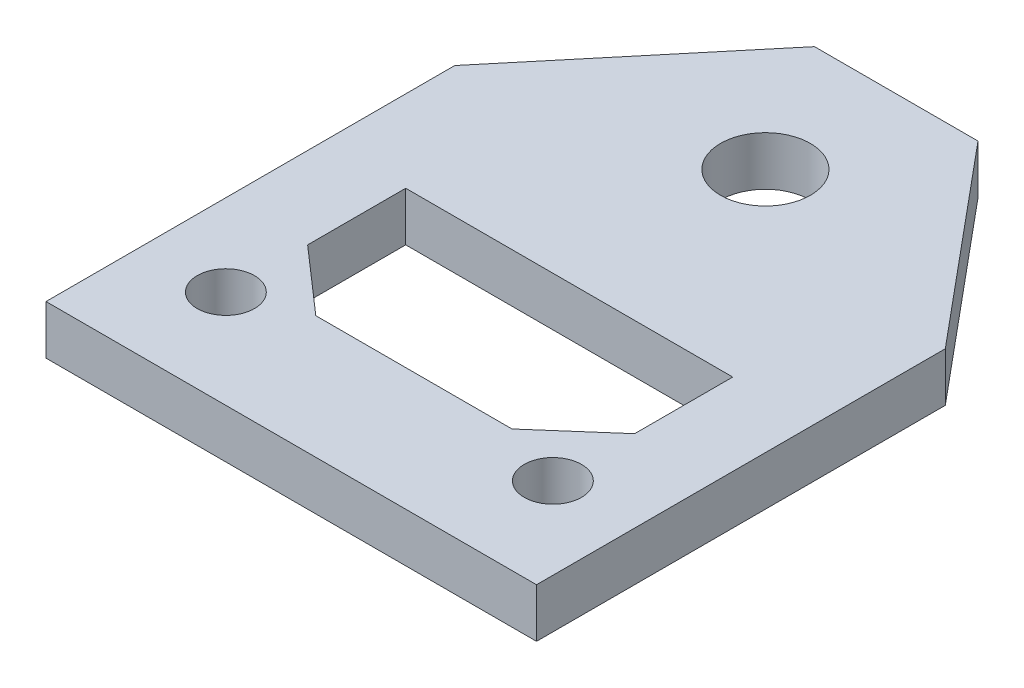
ISO-10303-21;
HEADER;
FILE_DESCRIPTION(('STEP AP214'),'2;1');
FILE_NAME('part.step','',(''),(''),'','','');
FILE_SCHEMA(('AUTOMOTIVE_DESIGN { 1 0 10303 214 1 1 1 1 }'));
ENDSEC;
DATA;
#1=APPLICATION_CONTEXT('core data for automotive mechanical design processes');
#2=APPLICATION_PROTOCOL_DEFINITION('international standard','automotive_design',2000,#1);
#3=PRODUCT_CONTEXT('',#1,'mechanical');
#4=PRODUCT('Part','Part','',(#3));
#5=PRODUCT_RELATED_PRODUCT_CATEGORY('part','',(#4));
#6=PRODUCT_DEFINITION_FORMATION('','',#4);
#7=PRODUCT_DEFINITION_CONTEXT('part definition',#1,'design');
#8=PRODUCT_DEFINITION('design','',#6,#7);
#9=PRODUCT_DEFINITION_SHAPE('','',#8);
#10=(LENGTH_UNIT() NAMED_UNIT(*) SI_UNIT(.MILLI.,.METRE.));
#11=(NAMED_UNIT(*) PLANE_ANGLE_UNIT() SI_UNIT($,.RADIAN.));
#12=(NAMED_UNIT(*) SI_UNIT($,.STERADIAN.) SOLID_ANGLE_UNIT());
#13=UNCERTAINTY_MEASURE_WITH_UNIT(LENGTH_MEASURE(1.E-05),#10,'distance_accuracy_value','');
#14=(GEOMETRIC_REPRESENTATION_CONTEXT(3) GLOBAL_UNCERTAINTY_ASSIGNED_CONTEXT((#13)) GLOBAL_UNIT_ASSIGNED_CONTEXT((#10,
#11,#12)) REPRESENTATION_CONTEXT('',''));
#15=CARTESIAN_POINT('',(0.,0.,0.));
#16=DIRECTION('',(0.,0.,1.));
#17=DIRECTION('',(1.,0.,0.));
#18=AXIS2_PLACEMENT_3D('',#15,#16,#17);
#19=CARTESIAN_POINT('',(15.,-3.,-25.));
#20=DIRECTION('',(1.,0.,0.));
#21=DIRECTION('',(0.,0.,-1.));
#22=AXIS2_PLACEMENT_3D('',#19,#20,#21);
#23=PLANE('',#22);
#24=DIRECTION('',(0.,0.,-1.));
#25=VECTOR('',#24,1.);
#26=CARTESIAN_POINT('',(15.,0.,-25.));
#27=LINE('',#26,#25);
#28=CARTESIAN_POINT('',(15.,0.,0.));
#29=VERTEX_POINT('',#28);
#30=CARTESIAN_POINT('',(15.,0.,-25.));
#31=VERTEX_POINT('',#30);
#32=EDGE_CURVE('E175',#29,#31,#27,.T.);
#33=ORIENTED_EDGE('',*,*,#32,.F.);
#34=DIRECTION('',(0.,1.,0.));
#35=VECTOR('',#34,1.);
#36=CARTESIAN_POINT('',(15.,-3.,0.));
#37=LINE('',#36,#35);
#38=CARTESIAN_POINT('',(15.,-3.,0.));
#39=VERTEX_POINT('',#38);
#40=EDGE_CURVE('E11',#39,#29,#37,.T.);
#41=ORIENTED_EDGE('',*,*,#40,.F.);
#42=DIRECTION('',(0.,0.,-1.));
#43=VECTOR('',#42,1.);
#44=CARTESIAN_POINT('',(15.,-3.,-25.));
#45=LINE('',#44,#43);
#46=CARTESIAN_POINT('',(15.,-3.,-25.));
#47=VERTEX_POINT('',#46);
#48=EDGE_CURVE('E183',#39,#47,#45,.T.);
#49=ORIENTED_EDGE('',*,*,#48,.T.);
#50=DIRECTION('',(0.,1.,0.));
#51=VECTOR('',#50,1.);
#52=CARTESIAN_POINT('',(15.,-3.,-25.));
#53=LINE('',#52,#51);
#54=EDGE_CURVE('E40',#47,#31,#53,.T.);
#55=ORIENTED_EDGE('',*,*,#54,.T.);
#56=EDGE_LOOP('',(#33,#41,#49,#55));
#57=FACE_BOUND('',#56,.T.);
#58=ADVANCED_FACE('F37',(#57),#23,.T.);
#59=CARTESIAN_POINT('',(-15.,-3.,0.));
#60=DIRECTION('',(0.,0.,1.));
#61=DIRECTION('',(1.,0.,0.));
#62=AXIS2_PLACEMENT_3D('',#59,#60,#61);
#63=PLANE('',#62);
#64=DIRECTION('',(1.,0.,0.));
#65=VECTOR('',#64,1.);
#66=CARTESIAN_POINT('',(-15.,0.,0.));
#67=LINE('',#66,#65);
#68=CARTESIAN_POINT('',(-15.,0.,0.));
#69=VERTEX_POINT('',#68);
#70=EDGE_CURVE('E187',#69,#29,#67,.T.);
#71=ORIENTED_EDGE('',*,*,#70,.F.);
#72=DIRECTION('',(0.,1.,0.));
#73=VECTOR('',#72,1.);
#74=CARTESIAN_POINT('',(-15.,-3.,0.));
#75=LINE('',#74,#73);
#76=CARTESIAN_POINT('',(-15.,-3.,0.));
#77=VERTEX_POINT('',#76);
#78=EDGE_CURVE('E45',#77,#69,#75,.T.);
#79=ORIENTED_EDGE('',*,*,#78,.F.);
#80=DIRECTION('',(1.,0.,0.));
#81=VECTOR('',#80,1.);
#82=CARTESIAN_POINT('',(-15.,-3.,0.));
#83=LINE('',#82,#81);
#84=EDGE_CURVE('E199',#77,#39,#83,.T.);
#85=ORIENTED_EDGE('',*,*,#84,.T.);
#86=ORIENTED_EDGE('',*,*,#40,.T.);
#87=EDGE_LOOP('',(#71,#79,#85,#86));
#88=FACE_BOUND('',#87,.T.);
#89=ADVANCED_FACE('F236',(#88),#63,.T.);
#90=CARTESIAN_POINT('',(-15.,-3.,-25.));
#91=DIRECTION('',(-1.,0.,0.));
#92=DIRECTION('',(0.,0.,1.));
#93=AXIS2_PLACEMENT_3D('',#90,#91,#92);
#94=PLANE('',#93);
#95=DIRECTION('',(0.,0.,1.));
#96=VECTOR('',#95,1.);
#97=CARTESIAN_POINT('',(-15.,0.,-25.));
#98=LINE('',#97,#96);
#99=CARTESIAN_POINT('',(-15.,0.,-25.));
#100=VERTEX_POINT('',#99);
#101=EDGE_CURVE('E213',#100,#69,#98,.T.);
#102=ORIENTED_EDGE('',*,*,#101,.F.);
#103=DIRECTION('',(0.,1.,0.));
#104=VECTOR('',#103,1.);
#105=CARTESIAN_POINT('',(-15.,-3.,-25.));
#106=LINE('',#105,#104);
#107=CARTESIAN_POINT('',(-15.,-3.,-25.));
#108=VERTEX_POINT('',#107);
#109=EDGE_CURVE('E219',#108,#100,#106,.T.);
#110=ORIENTED_EDGE('',*,*,#109,.F.);
#111=DIRECTION('',(0.,0.,1.));
#112=VECTOR('',#111,1.);
#113=CARTESIAN_POINT('',(-15.,-3.,-25.));
#114=LINE('',#113,#112);
#115=EDGE_CURVE('E196',#108,#77,#114,.T.);
#116=ORIENTED_EDGE('',*,*,#115,.T.);
#117=ORIENTED_EDGE('',*,*,#78,.T.);
#118=EDGE_LOOP('',(#102,#110,#116,#117));
#119=FACE_BOUND('',#118,.T.);
#120=ADVANCED_FACE('F247',(#119),#94,.T.);
#121=CARTESIAN_POINT('',(-5.,-3.,-37.));
#122=DIRECTION('',(-0.768221279597376,0.,-0.64018439966448));
#123=DIRECTION('',(-0.64018439966448,0.,0.768221279597376));
#124=AXIS2_PLACEMENT_3D('',#121,#122,#123);
#125=PLANE('',#124);
#126=DIRECTION('',(-0.64018439966448,0.,0.768221279597376));
#127=VECTOR('',#126,1.);
#128=CARTESIAN_POINT('',(-5.,0.,-37.));
#129=LINE('',#128,#127);
#130=CARTESIAN_POINT('',(-5.,0.,-37.));
#131=VERTEX_POINT('',#130);
#132=EDGE_CURVE('E210',#131,#100,#129,.T.);
#133=ORIENTED_EDGE('',*,*,#132,.F.);
#134=DIRECTION('',(0.,1.,0.));
#135=VECTOR('',#134,1.);
#136=CARTESIAN_POINT('',(-5.,-3.,-37.));
#137=LINE('',#136,#135);
#138=CARTESIAN_POINT('',(-5.,-3.,-37.));
#139=VERTEX_POINT('',#138);
#140=EDGE_CURVE('E221',#139,#131,#137,.T.);
#141=ORIENTED_EDGE('',*,*,#140,.F.);
#142=DIRECTION('',(-0.64018439966448,0.,0.768221279597376));
#143=VECTOR('',#142,1.);
#144=CARTESIAN_POINT('',(-5.,-3.,-37.));
#145=LINE('',#144,#143);
#146=EDGE_CURVE('E193',#139,#108,#145,.T.);
#147=ORIENTED_EDGE('',*,*,#146,.T.);
#148=ORIENTED_EDGE('',*,*,#109,.T.);
#149=EDGE_LOOP('',(#133,#141,#147,#148));
#150=FACE_BOUND('',#149,.T.);
#151=ADVANCED_FACE('F245',(#150),#125,.T.);
#152=CARTESIAN_POINT('',(-5.,-3.,-37.));
#153=DIRECTION('',(0.,0.,-1.));
#154=DIRECTION('',(-1.,0.,0.));
#155=AXIS2_PLACEMENT_3D('',#152,#153,#154);
#156=PLANE('',#155);
#157=DIRECTION('',(-1.,0.,0.));
#158=VECTOR('',#157,1.);
#159=CARTESIAN_POINT('',(-5.,0.,-37.));
#160=LINE('',#159,#158);
#161=CARTESIAN_POINT('',(5.,0.,-37.));
#162=VERTEX_POINT('',#161);
#163=EDGE_CURVE('E207',#162,#131,#160,.T.);
#164=ORIENTED_EDGE('',*,*,#163,.F.);
#165=DIRECTION('',(0.,1.,0.));
#166=VECTOR('',#165,1.);
#167=CARTESIAN_POINT('',(5.,-3.,-37.));
#168=LINE('',#167,#166);
#169=CARTESIAN_POINT('',(5.,-3.,-37.));
#170=VERTEX_POINT('',#169);
#171=EDGE_CURVE('E222',#170,#162,#168,.T.);
#172=ORIENTED_EDGE('',*,*,#171,.F.);
#173=DIRECTION('',(-1.,0.,0.));
#174=VECTOR('',#173,1.);
#175=CARTESIAN_POINT('',(-5.,-3.,-37.));
#176=LINE('',#175,#174);
#177=EDGE_CURVE('E190',#170,#139,#176,.T.);
#178=ORIENTED_EDGE('',*,*,#177,.T.);
#179=ORIENTED_EDGE('',*,*,#140,.T.);
#180=EDGE_LOOP('',(#164,#172,#178,#179));
#181=FACE_BOUND('',#180,.T.);
#182=ADVANCED_FACE('F242',(#181),#156,.T.);
#183=CARTESIAN_POINT('',(5.,-3.,-37.));
#184=DIRECTION('',(0.768221279597376,0.,-0.64018439966448));
#185=DIRECTION('',(-0.64018439966448,0.,-0.768221279597376));
#186=AXIS2_PLACEMENT_3D('',#183,#184,#185);
#187=PLANE('',#186);
#188=DIRECTION('',(-0.64018439966448,0.,-0.768221279597376));
#189=VECTOR('',#188,1.);
#190=CARTESIAN_POINT('',(5.,0.,-37.));
#191=LINE('',#190,#189);
#192=EDGE_CURVE('E204',#31,#162,#191,.T.);
#193=ORIENTED_EDGE('',*,*,#192,.F.);
#194=ORIENTED_EDGE('',*,*,#54,.F.);
#195=DIRECTION('',(-0.64018439966448,0.,-0.768221279597376));
#196=VECTOR('',#195,1.);
#197=CARTESIAN_POINT('',(5.,-3.,-37.));
#198=LINE('',#197,#196);
#199=EDGE_CURVE('E186',#47,#170,#198,.T.);
#200=ORIENTED_EDGE('',*,*,#199,.T.);
#201=ORIENTED_EDGE('',*,*,#171,.T.);
#202=EDGE_LOOP('',(#193,#194,#200,#201));
#203=FACE_BOUND('',#202,.T.);
#204=ADVANCED_FACE('F230',(#203),#187,.T.);
#205=CARTESIAN_POINT('',(0.,-3.,0.));
#206=DIRECTION('',(0.,1.,0.));
#207=DIRECTION('',(0.,0.,1.));
#208=AXIS2_PLACEMENT_3D('',#205,#206,#207);
#209=PLANE('',#208);
#210=CARTESIAN_POINT('',(0.,-3.,-29.));
#211=DIRECTION('',(0.,1.,0.));
#212=DIRECTION('',(0.,0.,1.));
#213=AXIS2_PLACEMENT_3D('',#210,#211,#212);
#214=CIRCLE('',#213,2.75);
#215=CARTESIAN_POINT('',(0.,-3.,-26.25));
#216=VERTEX_POINT('',#215);
#217=EDGE_CURVE('E398',#216,#216,#214,.T.);
#218=ORIENTED_EDGE('',*,*,#217,.T.);
#219=EDGE_LOOP('',(#218));
#220=FACE_BOUND('',#219,.T.);
#221=CARTESIAN_POINT('',(10.,-3.,-6.00000000000001));
#222=DIRECTION('',(0.,1.,0.));
#223=DIRECTION('',(0.,0.,1.));
#224=AXIS2_PLACEMENT_3D('',#221,#222,#223);
#225=CIRCLE('',#224,1.75);
#226=CARTESIAN_POINT('',(10.,-3.,-4.25000000000001));
#227=VERTEX_POINT('',#226);
#228=EDGE_CURVE('E406',#227,#227,#225,.T.);
#229=ORIENTED_EDGE('',*,*,#228,.T.);
#230=EDGE_LOOP('',(#229));
#231=FACE_BOUND('',#230,.T.);
#232=CARTESIAN_POINT('',(-10.,-3.,-6.));
#233=DIRECTION('',(0.,1.,0.));
#234=DIRECTION('',(0.,0.,1.));
#235=AXIS2_PLACEMENT_3D('',#232,#233,#234);
#236=CIRCLE('',#235,1.75);
#237=CARTESIAN_POINT('',(-10.,-3.,-4.25));
#238=VERTEX_POINT('',#237);
#239=EDGE_CURVE('E163',#238,#238,#236,.T.);
#240=ORIENTED_EDGE('',*,*,#239,.T.);
#241=EDGE_LOOP('',(#240));
#242=FACE_BOUND('',#241,.T.);
#243=DIRECTION('',(1.,0.,0.));
#244=VECTOR('',#243,1.);
#245=CARTESIAN_POINT('',(-6.,-3.,-7.5));
#246=LINE('',#245,#244);
#247=CARTESIAN_POINT('',(-6.,-3.,-7.5));
#248=VERTEX_POINT('',#247);
#249=CARTESIAN_POINT('',(6.,-3.,-7.5));
#250=VERTEX_POINT('',#249);
#251=EDGE_CURVE('E134',#248,#250,#246,.T.);
#252=ORIENTED_EDGE('',*,*,#251,.T.);
#253=DIRECTION('',(0.752576694706878,0.,-0.658504607868518));
#254=VECTOR('',#253,1.);
#255=CARTESIAN_POINT('',(6.,-3.,-7.5));
#256=LINE('',#255,#254);
#257=CARTESIAN_POINT('',(10.,-3.,-11.));
#258=VERTEX_POINT('',#257);
#259=EDGE_CURVE('E128',#250,#258,#256,.T.);
#260=ORIENTED_EDGE('',*,*,#259,.T.);
#261=DIRECTION('',(0.,0.,-1.));
#262=VECTOR('',#261,1.);
#263=CARTESIAN_POINT('',(9.99999999999999,-3.,-17.));
#264=LINE('',#263,#262);
#265=CARTESIAN_POINT('',(9.99999999999999,-3.,-17.));
#266=VERTEX_POINT('',#265);
#267=EDGE_CURVE('E137',#258,#266,#264,.T.);
#268=ORIENTED_EDGE('',*,*,#267,.T.);
#269=DIRECTION('',(-1.,0.,0.));
#270=VECTOR('',#269,1.);
#271=CARTESIAN_POINT('',(-10.,-3.,-17.));
#272=LINE('',#271,#270);
#273=CARTESIAN_POINT('',(-10.,-3.,-17.));
#274=VERTEX_POINT('',#273);
#275=EDGE_CURVE('E53',#266,#274,#272,.T.);
#276=ORIENTED_EDGE('',*,*,#275,.T.);
#277=DIRECTION('',(0.,0.,1.));
#278=VECTOR('',#277,1.);
#279=CARTESIAN_POINT('',(-10.,-3.,-17.));
#280=LINE('',#279,#278);
#281=CARTESIAN_POINT('',(-10.,-3.,-11.));
#282=VERTEX_POINT('',#281);
#283=EDGE_CURVE('E155',#274,#282,#280,.T.);
#284=ORIENTED_EDGE('',*,*,#283,.T.);
#285=DIRECTION('',(0.752576694706878,0.,0.658504607868518));
#286=VECTOR('',#285,1.);
#287=CARTESIAN_POINT('',(-10.,-3.,-11.));
#288=LINE('',#287,#286);
#289=EDGE_CURVE('E158',#282,#248,#288,.T.);
#290=ORIENTED_EDGE('',*,*,#289,.T.);
#291=EDGE_LOOP('',(#252,#260,#268,#276,#284,#290));
#292=FACE_BOUND('',#291,.T.);
#293=ORIENTED_EDGE('',*,*,#48,.F.);
#294=ORIENTED_EDGE('',*,*,#84,.F.);
#295=ORIENTED_EDGE('',*,*,#115,.F.);
#296=ORIENTED_EDGE('',*,*,#146,.F.);
#297=ORIENTED_EDGE('',*,*,#177,.F.);
#298=ORIENTED_EDGE('',*,*,#199,.F.);
#299=EDGE_LOOP('',(#293,#294,#295,#296,#297,#298));
#300=FACE_BOUND('',#299,.T.);
#301=ADVANCED_FACE('F141',(#220,#231,#242,#292,#300),#209,.F.);
#302=CARTESIAN_POINT('',(0.,0.,0.));
#303=DIRECTION('',(0.,1.,0.));
#304=DIRECTION('',(0.,0.,1.));
#305=AXIS2_PLACEMENT_3D('',#302,#303,#304);
#306=PLANE('',#305);
#307=CARTESIAN_POINT('',(0.,0.,-29.));
#308=DIRECTION('',(0.,1.,0.));
#309=DIRECTION('',(0.,0.,1.));
#310=AXIS2_PLACEMENT_3D('',#307,#308,#309);
#311=CIRCLE('',#310,2.75);
#312=CARTESIAN_POINT('',(0.,0.,-26.25));
#313=VERTEX_POINT('',#312);
#314=EDGE_CURVE('E401',#313,#313,#311,.T.);
#315=ORIENTED_EDGE('',*,*,#314,.F.);
#316=EDGE_LOOP('',(#315));
#317=FACE_BOUND('',#316,.T.);
#318=CARTESIAN_POINT('',(10.,0.,-6.00000000000001));
#319=DIRECTION('',(0.,1.,0.));
#320=DIRECTION('',(0.,0.,1.));
#321=AXIS2_PLACEMENT_3D('',#318,#319,#320);
#322=CIRCLE('',#321,1.75);
#323=CARTESIAN_POINT('',(10.,0.,-4.25000000000001));
#324=VERTEX_POINT('',#323);
#325=EDGE_CURVE('E403',#324,#324,#322,.T.);
#326=ORIENTED_EDGE('',*,*,#325,.F.);
#327=EDGE_LOOP('',(#326));
#328=FACE_BOUND('',#327,.T.);
#329=CARTESIAN_POINT('',(-10.,0.,-6.));
#330=DIRECTION('',(0.,1.,0.));
#331=DIRECTION('',(0.,0.,1.));
#332=AXIS2_PLACEMENT_3D('',#329,#330,#331);
#333=CIRCLE('',#332,1.75);
#334=CARTESIAN_POINT('',(-10.,0.,-4.25));
#335=VERTEX_POINT('',#334);
#336=EDGE_CURVE('E151',#335,#335,#333,.T.);
#337=ORIENTED_EDGE('',*,*,#336,.F.);
#338=EDGE_LOOP('',(#337));
#339=FACE_BOUND('',#338,.T.);
#340=DIRECTION('',(0.752576694706878,0.,-0.658504607868518));
#341=VECTOR('',#340,1.);
#342=CARTESIAN_POINT('',(6.,0.,-7.5));
#343=LINE('',#342,#341);
#344=CARTESIAN_POINT('',(6.,0.,-7.5));
#345=VERTEX_POINT('',#344);
#346=CARTESIAN_POINT('',(10.,0.,-11.));
#347=VERTEX_POINT('',#346);
#348=EDGE_CURVE('E61',#345,#347,#343,.T.);
#349=ORIENTED_EDGE('',*,*,#348,.F.);
#350=DIRECTION('',(1.,0.,0.));
#351=VECTOR('',#350,1.);
#352=CARTESIAN_POINT('',(-6.,0.,-7.5));
#353=LINE('',#352,#351);
#354=CARTESIAN_POINT('',(-6.,0.,-7.5));
#355=VERTEX_POINT('',#354);
#356=EDGE_CURVE('E145',#355,#345,#353,.T.);
#357=ORIENTED_EDGE('',*,*,#356,.F.);
#358=DIRECTION('',(0.752576694706878,0.,0.658504607868518));
#359=VECTOR('',#358,1.);
#360=CARTESIAN_POINT('',(-10.,0.,-11.));
#361=LINE('',#360,#359);
#362=CARTESIAN_POINT('',(-10.,0.,-11.));
#363=VERTEX_POINT('',#362);
#364=EDGE_CURVE('E148',#363,#355,#361,.T.);
#365=ORIENTED_EDGE('',*,*,#364,.F.);
#366=DIRECTION('',(0.,0.,1.));
#367=VECTOR('',#366,1.);
#368=CARTESIAN_POINT('',(-10.,0.,-17.));
#369=LINE('',#368,#367);
#370=CARTESIAN_POINT('',(-10.,0.,-17.));
#371=VERTEX_POINT('',#370);
#372=EDGE_CURVE('E168',#371,#363,#369,.T.);
#373=ORIENTED_EDGE('',*,*,#372,.F.);
#374=DIRECTION('',(-1.,0.,0.));
#375=VECTOR('',#374,1.);
#376=CARTESIAN_POINT('',(-10.,0.,-17.));
#377=LINE('',#376,#375);
#378=CARTESIAN_POINT('',(9.99999999999999,0.,-17.));
#379=VERTEX_POINT('',#378);
#380=EDGE_CURVE('E165',#379,#371,#377,.T.);
#381=ORIENTED_EDGE('',*,*,#380,.F.);
#382=DIRECTION('',(0.,0.,-1.));
#383=VECTOR('',#382,1.);
#384=CARTESIAN_POINT('',(9.99999999999999,0.,-17.));
#385=LINE('',#384,#383);
#386=EDGE_CURVE('E162',#347,#379,#385,.T.);
#387=ORIENTED_EDGE('',*,*,#386,.F.);
#388=EDGE_LOOP('',(#349,#357,#365,#373,#381,#387));
#389=FACE_BOUND('',#388,.T.);
#390=ORIENTED_EDGE('',*,*,#32,.T.);
#391=ORIENTED_EDGE('',*,*,#192,.T.);
#392=ORIENTED_EDGE('',*,*,#163,.T.);
#393=ORIENTED_EDGE('',*,*,#132,.T.);
#394=ORIENTED_EDGE('',*,*,#101,.T.);
#395=ORIENTED_EDGE('',*,*,#70,.T.);
#396=EDGE_LOOP('',(#390,#391,#392,#393,#394,#395));
#397=FACE_BOUND('',#396,.T.);
#398=ADVANCED_FACE('F232',(#317,#328,#339,#389,#397),#306,.T.);
#399=CARTESIAN_POINT('',(6.,-3.,-7.5));
#400=DIRECTION('',(0.658504607868518,0.,0.752576694706878));
#401=DIRECTION('',(0.752576694706878,0.,-0.658504607868518));
#402=AXIS2_PLACEMENT_3D('',#399,#400,#401);
#403=PLANE('',#402);
#404=ORIENTED_EDGE('',*,*,#348,.T.);
#405=DIRECTION('',(0.,1.,0.));
#406=VECTOR('',#405,1.);
#407=CARTESIAN_POINT('',(10.,-3.,-11.));
#408=LINE('',#407,#406);
#409=EDGE_CURVE('E124',#258,#347,#408,.T.);
#410=ORIENTED_EDGE('',*,*,#409,.F.);
#411=ORIENTED_EDGE('',*,*,#259,.F.);
#412=DIRECTION('',(0.,1.,0.));
#413=VECTOR('',#412,1.);
#414=CARTESIAN_POINT('',(6.,-3.,-7.5));
#415=LINE('',#414,#413);
#416=EDGE_CURVE('E173',#250,#345,#415,.T.);
#417=ORIENTED_EDGE('',*,*,#416,.T.);
#418=EDGE_LOOP('',(#404,#410,#411,#417));
#419=FACE_BOUND('',#418,.T.);
#420=ADVANCED_FACE('F126',(#419),#403,.F.);
#421=CARTESIAN_POINT('',(-6.,-3.,-7.5));
#422=DIRECTION('',(0.,0.,1.));
#423=DIRECTION('',(1.,0.,0.));
#424=AXIS2_PLACEMENT_3D('',#421,#422,#423);
#425=PLANE('',#424);
#426=ORIENTED_EDGE('',*,*,#356,.T.);
#427=ORIENTED_EDGE('',*,*,#416,.F.);
#428=ORIENTED_EDGE('',*,*,#251,.F.);
#429=DIRECTION('',(0.,1.,0.));
#430=VECTOR('',#429,1.);
#431=CARTESIAN_POINT('',(-6.,-3.,-7.5));
#432=LINE('',#431,#430);
#433=EDGE_CURVE('E176',#248,#355,#432,.T.);
#434=ORIENTED_EDGE('',*,*,#433,.T.);
#435=EDGE_LOOP('',(#426,#427,#428,#434));
#436=FACE_BOUND('',#435,.T.);
#437=ADVANCED_FACE('F315',(#436),#425,.F.);
#438=CARTESIAN_POINT('',(-10.,-3.,-11.));
#439=DIRECTION('',(-0.658504607868518,0.,0.752576694706878));
#440=DIRECTION('',(0.752576694706878,0.,0.658504607868518));
#441=AXIS2_PLACEMENT_3D('',#438,#439,#440);
#442=PLANE('',#441);
#443=ORIENTED_EDGE('',*,*,#364,.T.);
#444=ORIENTED_EDGE('',*,*,#433,.F.);
#445=ORIENTED_EDGE('',*,*,#289,.F.);
#446=DIRECTION('',(0.,1.,0.));
#447=VECTOR('',#446,1.);
#448=CARTESIAN_POINT('',(-10.,-3.,-11.));
#449=LINE('',#448,#447);
#450=EDGE_CURVE('E178',#282,#363,#449,.T.);
#451=ORIENTED_EDGE('',*,*,#450,.T.);
#452=EDGE_LOOP('',(#443,#444,#445,#451));
#453=FACE_BOUND('',#452,.T.);
#454=ADVANCED_FACE('F324',(#453),#442,.F.);
#455=CARTESIAN_POINT('',(-10.,-3.,-17.));
#456=DIRECTION('',(-1.,0.,0.));
#457=DIRECTION('',(0.,0.,1.));
#458=AXIS2_PLACEMENT_3D('',#455,#456,#457);
#459=PLANE('',#458);
#460=ORIENTED_EDGE('',*,*,#372,.T.);
#461=ORIENTED_EDGE('',*,*,#450,.F.);
#462=ORIENTED_EDGE('',*,*,#283,.F.);
#463=DIRECTION('',(0.,1.,0.));
#464=VECTOR('',#463,1.);
#465=CARTESIAN_POINT('',(-10.,-3.,-17.));
#466=LINE('',#465,#464);
#467=EDGE_CURVE('E180',#274,#371,#466,.T.);
#468=ORIENTED_EDGE('',*,*,#467,.T.);
#469=EDGE_LOOP('',(#460,#461,#462,#468));
#470=FACE_BOUND('',#469,.T.);
#471=ADVANCED_FACE('F334',(#470),#459,.F.);
#472=CARTESIAN_POINT('',(-10.,-3.,-17.));
#473=DIRECTION('',(0.,0.,-1.));
#474=DIRECTION('',(-1.,0.,0.));
#475=AXIS2_PLACEMENT_3D('',#472,#473,#474);
#476=PLANE('',#475);
#477=ORIENTED_EDGE('',*,*,#380,.T.);
#478=ORIENTED_EDGE('',*,*,#467,.F.);
#479=ORIENTED_EDGE('',*,*,#275,.F.);
#480=DIRECTION('',(0.,1.,0.));
#481=VECTOR('',#480,1.);
#482=CARTESIAN_POINT('',(9.99999999999999,-3.,-17.));
#483=LINE('',#482,#481);
#484=EDGE_CURVE('E133',#266,#379,#483,.T.);
#485=ORIENTED_EDGE('',*,*,#484,.T.);
#486=EDGE_LOOP('',(#477,#478,#479,#485));
#487=FACE_BOUND('',#486,.T.);
#488=ADVANCED_FACE('F344',(#487),#476,.F.);
#489=CARTESIAN_POINT('',(9.99999999999999,-3.,-17.));
#490=DIRECTION('',(1.,0.,0.));
#491=DIRECTION('',(0.,0.,-1.));
#492=AXIS2_PLACEMENT_3D('',#489,#490,#491);
#493=PLANE('',#492);
#494=ORIENTED_EDGE('',*,*,#386,.T.);
#495=ORIENTED_EDGE('',*,*,#484,.F.);
#496=ORIENTED_EDGE('',*,*,#267,.F.);
#497=ORIENTED_EDGE('',*,*,#409,.T.);
#498=EDGE_LOOP('',(#494,#495,#496,#497));
#499=FACE_BOUND('',#498,.T.);
#500=ADVANCED_FACE('F138',(#499),#493,.F.);
#501=CARTESIAN_POINT('',(-10.,-3.,-6.));
#502=DIRECTION('',(0.,1.,0.));
#503=DIRECTION('',(0.,0.,1.));
#504=AXIS2_PLACEMENT_3D('',#501,#502,#503);
#505=CYLINDRICAL_SURFACE('',#504,1.75);
#506=ORIENTED_EDGE('',*,*,#239,.F.);
#507=EDGE_LOOP('',(#506));
#508=FACE_BOUND('',#507,.T.);
#509=ORIENTED_EDGE('',*,*,#336,.T.);
#510=EDGE_LOOP('',(#509));
#511=FACE_BOUND('',#510,.T.);
#512=ADVANCED_FACE('F362',(#508,#511),#505,.F.);
#513=CARTESIAN_POINT('',(10.,-3.,-6.00000000000001));
#514=DIRECTION('',(0.,1.,0.));
#515=DIRECTION('',(0.,0.,1.));
#516=AXIS2_PLACEMENT_3D('',#513,#514,#515);
#517=CYLINDRICAL_SURFACE('',#516,1.75);
#518=ORIENTED_EDGE('',*,*,#228,.F.);
#519=EDGE_LOOP('',(#518));
#520=FACE_BOUND('',#519,.T.);
#521=ORIENTED_EDGE('',*,*,#325,.T.);
#522=EDGE_LOOP('',(#521));
#523=FACE_BOUND('',#522,.T.);
#524=ADVANCED_FACE('F371',(#520,#523),#517,.F.);
#525=CARTESIAN_POINT('',(0.,-3.,-29.));
#526=DIRECTION('',(0.,1.,0.));
#527=DIRECTION('',(0.,0.,1.));
#528=AXIS2_PLACEMENT_3D('',#525,#526,#527);
#529=CYLINDRICAL_SURFACE('',#528,2.75);
#530=ORIENTED_EDGE('',*,*,#217,.F.);
#531=EDGE_LOOP('',(#530));
#532=FACE_BOUND('',#531,.T.);
#533=ORIENTED_EDGE('',*,*,#314,.T.);
#534=EDGE_LOOP('',(#533));
#535=FACE_BOUND('',#534,.T.);
#536=ADVANCED_FACE('F381',(#532,#535),#529,.F.);
#537=CLOSED_SHELL('',(#58,#89,#120,#151,#182,#204,#301,#398,#420,#437,#454,#471,#488,#500,#512,
#524,#536));
#538=MANIFOLD_SOLID_BREP('B2',#537);
#539=ADVANCED_BREP_SHAPE_REPRESENTATION('',(#18,#538),#14);
#540=SHAPE_DEFINITION_REPRESENTATION(#9,#539);
ENDSEC;
END-ISO-10303-21;
